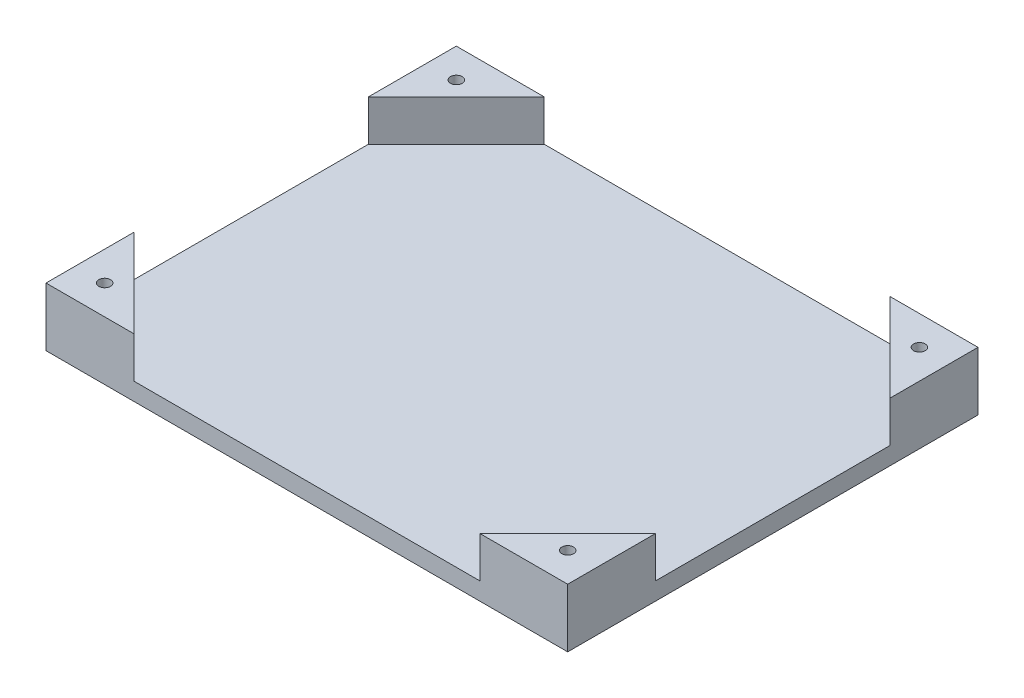
ISO-10303-21;
HEADER;
FILE_DESCRIPTION(('STEP AP214'),'2;1');
FILE_NAME('part.step','',(''),(''),'','','');
FILE_SCHEMA(('AUTOMOTIVE_DESIGN { 1 0 10303 214 1 1 1 1 }'));
ENDSEC;
DATA;
#1=APPLICATION_CONTEXT('core data for automotive mechanical design processes');
#2=APPLICATION_PROTOCOL_DEFINITION('international standard','automotive_design',2000,#1);
#3=PRODUCT_CONTEXT('',#1,'mechanical');
#4=PRODUCT('Part','Part','',(#3));
#5=PRODUCT_RELATED_PRODUCT_CATEGORY('part','',(#4));
#6=PRODUCT_DEFINITION_FORMATION('','',#4);
#7=PRODUCT_DEFINITION_CONTEXT('part definition',#1,'design');
#8=PRODUCT_DEFINITION('design','',#6,#7);
#9=PRODUCT_DEFINITION_SHAPE('','',#8);
#10=(LENGTH_UNIT() NAMED_UNIT(*) SI_UNIT(.MILLI.,.METRE.));
#11=(NAMED_UNIT(*) PLANE_ANGLE_UNIT() SI_UNIT($,.RADIAN.));
#12=(NAMED_UNIT(*) SI_UNIT($,.STERADIAN.) SOLID_ANGLE_UNIT());
#13=UNCERTAINTY_MEASURE_WITH_UNIT(LENGTH_MEASURE(1.E-05),#10,'distance_accuracy_value','');
#14=(GEOMETRIC_REPRESENTATION_CONTEXT(3) GLOBAL_UNCERTAINTY_ASSIGNED_CONTEXT((#13)) GLOBAL_UNIT_ASSIGNED_CONTEXT((#10,
#11,#12)) REPRESENTATION_CONTEXT('',''));
#15=CARTESIAN_POINT('',(0.,0.,0.));
#16=DIRECTION('',(0.,0.,1.));
#17=DIRECTION('',(1.,0.,0.));
#18=AXIS2_PLACEMENT_3D('',#15,#16,#17);
#19=CARTESIAN_POINT('',(0.,10.,0.));
#20=DIRECTION('',(0.,-1.,0.));
#21=DIRECTION('',(0.,0.,-1.));
#22=AXIS2_PLACEMENT_3D('',#19,#20,#21);
#23=PLANE('',#22);
#24=CARTESIAN_POINT('',(-39.5,10.,-30.));
#25=DIRECTION('',(0.,1.,0.));
#26=DIRECTION('',(0.,0.,1.));
#27=AXIS2_PLACEMENT_3D('',#24,#25,#26);
#28=CIRCLE('',#27,0.999999999999998);
#29=CARTESIAN_POINT('',(-39.5,10.,-29.));
#30=VERTEX_POINT('',#29);
#31=EDGE_CURVE('E184',#30,#30,#28,.T.);
#32=ORIENTED_EDGE('',*,*,#31,.F.);
#33=EDGE_LOOP('',(#32));
#34=FACE_BOUND('',#33,.T.);
#35=DIRECTION('',(0.,0.,1.));
#36=VECTOR('',#35,1.);
#37=CARTESIAN_POINT('',(-44.5,10.,35.));
#38=LINE('',#37,#36);
#39=CARTESIAN_POINT('',(-44.5,10.,-35.));
#40=VERTEX_POINT('',#39);
#41=CARTESIAN_POINT('',(-44.5,10.,-19.9999999999999));
#42=VERTEX_POINT('',#41);
#43=EDGE_CURVE('E195',#40,#42,#38,.T.);
#44=ORIENTED_EDGE('',*,*,#43,.T.);
#45=DIRECTION('',(-0.707106781186544,0.,0.707106781186551));
#46=VECTOR('',#45,1.);
#47=CARTESIAN_POINT('',(-29.5000000000001,10.,-35.));
#48=LINE('',#47,#46);
#49=CARTESIAN_POINT('',(-29.5000000000001,10.,-35.));
#50=VERTEX_POINT('',#49);
#51=EDGE_CURVE('E151',#50,#42,#48,.T.);
#52=ORIENTED_EDGE('',*,*,#51,.F.);
#53=DIRECTION('',(-1.,0.,0.));
#54=VECTOR('',#53,1.);
#55=CARTESIAN_POINT('',(-44.5,10.,-35.));
#56=LINE('',#55,#54);
#57=EDGE_CURVE('E192',#50,#40,#56,.T.);
#58=ORIENTED_EDGE('',*,*,#57,.T.);
#59=EDGE_LOOP('',(#44,#52,#58));
#60=FACE_BOUND('',#59,.T.);
#61=ADVANCED_FACE('F33',(#34,#60),#23,.F.);
#62=CARTESIAN_POINT('',(39.5,10.,-30.));
#63=DIRECTION('',(0.,1.,0.));
#64=DIRECTION('',(0.,0.,-1.));
#65=AXIS2_PLACEMENT_3D('',#62,#63,#64);
#66=CIRCLE('',#65,0.999999999999998);
#67=CARTESIAN_POINT('',(39.5,10.,-31.));
#68=VERTEX_POINT('',#67);
#69=EDGE_CURVE('E178',#68,#68,#66,.T.);
#70=ORIENTED_EDGE('',*,*,#69,.F.);
#71=EDGE_LOOP('',(#70));
#72=FACE_BOUND('',#71,.T.);
#73=CARTESIAN_POINT('',(44.5,10.,-35.));
#74=VERTEX_POINT('',#73);
#75=CARTESIAN_POINT('',(29.4999999999999,10.,-35.));
#76=VERTEX_POINT('',#75);
#77=EDGE_CURVE('E193',#74,#76,#56,.T.);
#78=ORIENTED_EDGE('',*,*,#77,.T.);
#79=DIRECTION('',(-0.707106781186549,0.,-0.707106781186546));
#80=VECTOR('',#79,1.);
#81=CARTESIAN_POINT('',(44.5,10.,-20.));
#82=LINE('',#81,#80);
#83=CARTESIAN_POINT('',(44.5,10.,-20.));
#84=VERTEX_POINT('',#83);
#85=EDGE_CURVE('E240',#84,#76,#82,.T.);
#86=ORIENTED_EDGE('',*,*,#85,.F.);
#87=DIRECTION('',(0.,0.,-1.));
#88=VECTOR('',#87,1.);
#89=CARTESIAN_POINT('',(44.5,10.,35.));
#90=LINE('',#89,#88);
#91=EDGE_CURVE('E87',#84,#74,#90,.T.);
#92=ORIENTED_EDGE('',*,*,#91,.T.);
#93=EDGE_LOOP('',(#78,#86,#92));
#94=FACE_BOUND('',#93,.T.);
#95=ADVANCED_FACE('F260',(#72,#94),#23,.F.);
#96=CARTESIAN_POINT('',(39.5,10.,30.));
#97=DIRECTION('',(0.,1.,0.));
#98=DIRECTION('',(0.,0.,1.));
#99=AXIS2_PLACEMENT_3D('',#96,#97,#98);
#100=CIRCLE('',#99,0.999999999999998);
#101=CARTESIAN_POINT('',(39.5,10.,31.));
#102=VERTEX_POINT('',#101);
#103=EDGE_CURVE('E172',#102,#102,#100,.T.);
#104=ORIENTED_EDGE('',*,*,#103,.F.);
#105=EDGE_LOOP('',(#104));
#106=FACE_BOUND('',#105,.T.);
#107=CARTESIAN_POINT('',(44.5,10.,35.));
#108=VERTEX_POINT('',#107);
#109=CARTESIAN_POINT('',(44.5,10.,20.));
#110=VERTEX_POINT('',#109);
#111=EDGE_CURVE('E190',#108,#110,#90,.T.);
#112=ORIENTED_EDGE('',*,*,#111,.T.);
#113=DIRECTION('',(0.707106781186546,0.,-0.707106781186549));
#114=VECTOR('',#113,1.);
#115=CARTESIAN_POINT('',(29.5,10.,35.));
#116=LINE('',#115,#114);
#117=CARTESIAN_POINT('',(29.5,10.,35.));
#118=VERTEX_POINT('',#117);
#119=EDGE_CURVE('E242',#118,#110,#116,.T.);
#120=ORIENTED_EDGE('',*,*,#119,.F.);
#121=DIRECTION('',(1.,0.,0.));
#122=VECTOR('',#121,1.);
#123=CARTESIAN_POINT('',(-44.5,10.,35.));
#124=LINE('',#123,#122);
#125=EDGE_CURVE('E57',#118,#108,#124,.T.);
#126=ORIENTED_EDGE('',*,*,#125,.T.);
#127=EDGE_LOOP('',(#112,#120,#126));
#128=FACE_BOUND('',#127,.T.);
#129=ADVANCED_FACE('F275',(#106,#128),#23,.F.);
#130=CARTESIAN_POINT('',(-44.5,10.,35.));
#131=VERTEX_POINT('',#130);
#132=CARTESIAN_POINT('',(-29.4999999999999,10.,35.));
#133=VERTEX_POINT('',#132);
#134=EDGE_CURVE('E198',#131,#133,#124,.T.);
#135=ORIENTED_EDGE('',*,*,#134,.T.);
#136=DIRECTION('',(0.707106781186549,0.,0.707106781186546));
#137=VECTOR('',#136,1.);
#138=CARTESIAN_POINT('',(-44.5,10.,20.));
#139=LINE('',#138,#137);
#140=CARTESIAN_POINT('',(-44.5,10.,20.));
#141=VERTEX_POINT('',#140);
#142=EDGE_CURVE('E244',#141,#133,#139,.T.);
#143=ORIENTED_EDGE('',*,*,#142,.F.);
#144=EDGE_CURVE('E156',#141,#131,#38,.T.);
#145=ORIENTED_EDGE('',*,*,#144,.T.);
#146=EDGE_LOOP('',(#135,#143,#145));
#147=FACE_BOUND('',#146,.T.);
#148=CARTESIAN_POINT('',(-39.5,10.,30.));
#149=DIRECTION('',(0.,1.,0.));
#150=DIRECTION('',(0.,0.,-1.));
#151=AXIS2_PLACEMENT_3D('',#148,#149,#150);
#152=CIRCLE('',#151,0.999999999999998);
#153=CARTESIAN_POINT('',(-39.5,10.,29.));
#154=VERTEX_POINT('',#153);
#155=EDGE_CURVE('E164',#154,#154,#152,.T.);
#156=ORIENTED_EDGE('',*,*,#155,.F.);
#157=EDGE_LOOP('',(#156));
#158=FACE_BOUND('',#157,.T.);
#159=ADVANCED_FACE('F271',(#147,#158),#23,.F.);
#160=CARTESIAN_POINT('',(0.,0.,0.));
#161=DIRECTION('',(0.,-1.,0.));
#162=DIRECTION('',(0.,0.,-1.));
#163=AXIS2_PLACEMENT_3D('',#160,#161,#162);
#164=PLANE('',#163);
#165=CARTESIAN_POINT('',(39.5,0.,30.));
#166=DIRECTION('',(0.,1.,0.));
#167=DIRECTION('',(0.,0.,1.));
#168=AXIS2_PLACEMENT_3D('',#165,#166,#167);
#169=CIRCLE('',#168,0.999999999999998);
#170=CARTESIAN_POINT('',(39.5,0.,31.));
#171=VERTEX_POINT('',#170);
#172=EDGE_CURVE('E167',#171,#171,#169,.T.);
#173=ORIENTED_EDGE('',*,*,#172,.T.);
#174=EDGE_LOOP('',(#173));
#175=FACE_BOUND('',#174,.T.);
#176=CARTESIAN_POINT('',(-39.5,0.,-30.));
#177=DIRECTION('',(0.,1.,0.));
#178=DIRECTION('',(0.,0.,1.));
#179=AXIS2_PLACEMENT_3D('',#176,#177,#178);
#180=CIRCLE('',#179,0.999999999999998);
#181=CARTESIAN_POINT('',(-39.5,0.,-29.));
#182=VERTEX_POINT('',#181);
#183=EDGE_CURVE('E181',#182,#182,#180,.T.);
#184=ORIENTED_EDGE('',*,*,#183,.T.);
#185=EDGE_LOOP('',(#184));
#186=FACE_BOUND('',#185,.T.);
#187=DIRECTION('',(0.,0.,-1.));
#188=VECTOR('',#187,1.);
#189=CARTESIAN_POINT('',(44.5,0.,35.));
#190=LINE('',#189,#188);
#191=CARTESIAN_POINT('',(44.5,0.,35.));
#192=VERTEX_POINT('',#191);
#193=CARTESIAN_POINT('',(44.5,0.,-35.));
#194=VERTEX_POINT('',#193);
#195=EDGE_CURVE('E187',#192,#194,#190,.T.);
#196=ORIENTED_EDGE('',*,*,#195,.F.);
#197=DIRECTION('',(1.,0.,0.));
#198=VECTOR('',#197,1.);
#199=CARTESIAN_POINT('',(-44.5,0.,35.));
#200=LINE('',#199,#198);
#201=CARTESIAN_POINT('',(-44.5,0.,35.));
#202=VERTEX_POINT('',#201);
#203=EDGE_CURVE('E79',#202,#192,#200,.T.);
#204=ORIENTED_EDGE('',*,*,#203,.F.);
#205=DIRECTION('',(0.,0.,1.));
#206=VECTOR('',#205,1.);
#207=CARTESIAN_POINT('',(-44.5,0.,35.));
#208=LINE('',#207,#206);
#209=CARTESIAN_POINT('',(-44.5,0.,-35.));
#210=VERTEX_POINT('',#209);
#211=EDGE_CURVE('E206',#210,#202,#208,.T.);
#212=ORIENTED_EDGE('',*,*,#211,.F.);
#213=DIRECTION('',(-1.,0.,0.));
#214=VECTOR('',#213,1.);
#215=CARTESIAN_POINT('',(-44.5,0.,-35.));
#216=LINE('',#215,#214);
#217=EDGE_CURVE('E204',#194,#210,#216,.T.);
#218=ORIENTED_EDGE('',*,*,#217,.F.);
#219=EDGE_LOOP('',(#196,#204,#212,#218));
#220=FACE_BOUND('',#219,.T.);
#221=CARTESIAN_POINT('',(39.5,0.,-30.));
#222=DIRECTION('',(0.,1.,0.));
#223=DIRECTION('',(0.,0.,-1.));
#224=AXIS2_PLACEMENT_3D('',#221,#222,#223);
#225=CIRCLE('',#224,0.999999999999998);
#226=CARTESIAN_POINT('',(39.5,0.,-31.));
#227=VERTEX_POINT('',#226);
#228=EDGE_CURVE('E175',#227,#227,#225,.T.);
#229=ORIENTED_EDGE('',*,*,#228,.T.);
#230=EDGE_LOOP('',(#229));
#231=FACE_BOUND('',#230,.T.);
#232=CARTESIAN_POINT('',(-39.5,0.,30.));
#233=DIRECTION('',(0.,1.,0.));
#234=DIRECTION('',(0.,0.,-1.));
#235=AXIS2_PLACEMENT_3D('',#232,#233,#234);
#236=CIRCLE('',#235,0.999999999999998);
#237=CARTESIAN_POINT('',(-39.5,0.,29.));
#238=VERTEX_POINT('',#237);
#239=EDGE_CURVE('E168',#238,#238,#236,.T.);
#240=ORIENTED_EDGE('',*,*,#239,.T.);
#241=EDGE_LOOP('',(#240));
#242=FACE_BOUND('',#241,.T.);
#243=ADVANCED_FACE('F219',(#175,#186,#220,#231,#242),#164,.T.);
#244=CARTESIAN_POINT('',(44.5,10.,35.));
#245=DIRECTION('',(-1.,0.,0.));
#246=DIRECTION('',(0.,0.,1.));
#247=AXIS2_PLACEMENT_3D('',#244,#245,#246);
#248=PLANE('',#247);
#249=ORIENTED_EDGE('',*,*,#91,.F.);
#250=DIRECTION('',(0.,1.,0.));
#251=VECTOR('',#250,1.);
#252=CARTESIAN_POINT('',(44.5,3.,-20.));
#253=LINE('',#252,#251);
#254=CARTESIAN_POINT('',(44.5,3.,-20.));
#255=VERTEX_POINT('',#254);
#256=EDGE_CURVE('E229',#255,#84,#253,.T.);
#257=ORIENTED_EDGE('',*,*,#256,.F.);
#258=DIRECTION('',(0.,0.,-1.));
#259=VECTOR('',#258,1.);
#260=CARTESIAN_POINT('',(44.5,3.,20.));
#261=LINE('',#260,#259);
#262=CARTESIAN_POINT('',(44.5,3.,20.));
#263=VERTEX_POINT('',#262);
#264=EDGE_CURVE('E250',#263,#255,#261,.T.);
#265=ORIENTED_EDGE('',*,*,#264,.F.);
#266=DIRECTION('',(0.,1.,0.));
#267=VECTOR('',#266,1.);
#268=CARTESIAN_POINT('',(44.5,3.,20.));
#269=LINE('',#268,#267);
#270=EDGE_CURVE('E228',#263,#110,#269,.T.);
#271=ORIENTED_EDGE('',*,*,#270,.T.);
#272=ORIENTED_EDGE('',*,*,#111,.F.);
#273=DIRECTION('',(0.,-1.,0.));
#274=VECTOR('',#273,1.);
#275=CARTESIAN_POINT('',(44.5,10.,35.));
#276=LINE('',#275,#274);
#277=EDGE_CURVE('E201',#108,#192,#276,.T.);
#278=ORIENTED_EDGE('',*,*,#277,.T.);
#279=ORIENTED_EDGE('',*,*,#195,.T.);
#280=DIRECTION('',(0.,-1.,0.));
#281=VECTOR('',#280,1.);
#282=CARTESIAN_POINT('',(44.5,10.,-35.));
#283=LINE('',#282,#281);
#284=EDGE_CURVE('E11',#74,#194,#283,.T.);
#285=ORIENTED_EDGE('',*,*,#284,.F.);
#286=EDGE_LOOP('',(#249,#257,#265,#271,#272,#278,#279,#285));
#287=FACE_BOUND('',#286,.T.);
#288=ADVANCED_FACE('F35',(#287),#248,.F.);
#289=CARTESIAN_POINT('',(-44.5,10.,-35.));
#290=DIRECTION('',(0.,0.,1.));
#291=DIRECTION('',(1.,0.,0.));
#292=AXIS2_PLACEMENT_3D('',#289,#290,#291);
#293=PLANE('',#292);
#294=ORIENTED_EDGE('',*,*,#57,.F.);
#295=DIRECTION('',(0.,1.,0.));
#296=VECTOR('',#295,1.);
#297=CARTESIAN_POINT('',(-29.5000000000001,3.,-35.));
#298=LINE('',#297,#296);
#299=CARTESIAN_POINT('',(-29.5000000000001,3.,-35.));
#300=VERTEX_POINT('',#299);
#301=EDGE_CURVE('E236',#300,#50,#298,.T.);
#302=ORIENTED_EDGE('',*,*,#301,.F.);
#303=DIRECTION('',(-1.,0.,0.));
#304=VECTOR('',#303,1.);
#305=CARTESIAN_POINT('',(29.4999999999999,3.,-35.));
#306=LINE('',#305,#304);
#307=CARTESIAN_POINT('',(29.4999999999999,3.,-35.));
#308=VERTEX_POINT('',#307);
#309=EDGE_CURVE('E160',#308,#300,#306,.T.);
#310=ORIENTED_EDGE('',*,*,#309,.F.);
#311=DIRECTION('',(0.,1.,0.));
#312=VECTOR('',#311,1.);
#313=CARTESIAN_POINT('',(29.4999999999999,3.,-35.));
#314=LINE('',#313,#312);
#315=EDGE_CURVE('E233',#308,#76,#314,.T.);
#316=ORIENTED_EDGE('',*,*,#315,.T.);
#317=ORIENTED_EDGE('',*,*,#77,.F.);
#318=ORIENTED_EDGE('',*,*,#284,.T.);
#319=ORIENTED_EDGE('',*,*,#217,.T.);
#320=DIRECTION('',(0.,-1.,0.));
#321=VECTOR('',#320,1.);
#322=CARTESIAN_POINT('',(-44.5,10.,-35.));
#323=LINE('',#322,#321);
#324=EDGE_CURVE('E41',#40,#210,#323,.T.);
#325=ORIENTED_EDGE('',*,*,#324,.F.);
#326=EDGE_LOOP('',(#294,#302,#310,#316,#317,#318,#319,#325));
#327=FACE_BOUND('',#326,.T.);
#328=ADVANCED_FACE('F261',(#327),#293,.F.);
#329=CARTESIAN_POINT('',(-44.5,10.,35.));
#330=DIRECTION('',(1.,0.,0.));
#331=DIRECTION('',(0.,0.,-1.));
#332=AXIS2_PLACEMENT_3D('',#329,#330,#331);
#333=PLANE('',#332);
#334=DIRECTION('',(0.,0.,1.));
#335=VECTOR('',#334,1.);
#336=CARTESIAN_POINT('',(-44.5,3.,-19.9999999999999));
#337=LINE('',#336,#335);
#338=CARTESIAN_POINT('',(-44.5,3.,-19.9999999999999));
#339=VERTEX_POINT('',#338);
#340=CARTESIAN_POINT('',(-44.5,3.,20.));
#341=VERTEX_POINT('',#340);
#342=EDGE_CURVE('E142',#339,#341,#337,.T.);
#343=ORIENTED_EDGE('',*,*,#342,.F.);
#344=DIRECTION('',(0.,1.,0.));
#345=VECTOR('',#344,1.);
#346=CARTESIAN_POINT('',(-44.5,3.,-19.9999999999999));
#347=LINE('',#346,#345);
#348=EDGE_CURVE('E171',#339,#42,#347,.T.);
#349=ORIENTED_EDGE('',*,*,#348,.T.);
#350=ORIENTED_EDGE('',*,*,#43,.F.);
#351=ORIENTED_EDGE('',*,*,#324,.T.);
#352=ORIENTED_EDGE('',*,*,#211,.T.);
#353=DIRECTION('',(0.,-1.,0.));
#354=VECTOR('',#353,1.);
#355=CARTESIAN_POINT('',(-44.5,10.,35.));
#356=LINE('',#355,#354);
#357=EDGE_CURVE('E210',#131,#202,#356,.T.);
#358=ORIENTED_EDGE('',*,*,#357,.F.);
#359=ORIENTED_EDGE('',*,*,#144,.F.);
#360=DIRECTION('',(0.,1.,0.));
#361=VECTOR('',#360,1.);
#362=CARTESIAN_POINT('',(-44.5,3.,20.));
#363=LINE('',#362,#361);
#364=EDGE_CURVE('E136',#341,#141,#363,.T.);
#365=ORIENTED_EDGE('',*,*,#364,.F.);
#366=EDGE_LOOP('',(#343,#349,#350,#351,#352,#358,#359,#365));
#367=FACE_BOUND('',#366,.T.);
#368=ADVANCED_FACE('F154',(#367),#333,.F.);
#369=CARTESIAN_POINT('',(-44.5,10.,35.));
#370=DIRECTION('',(0.,0.,-1.));
#371=DIRECTION('',(-1.,0.,0.));
#372=AXIS2_PLACEMENT_3D('',#369,#370,#371);
#373=PLANE('',#372);
#374=ORIENTED_EDGE('',*,*,#125,.F.);
#375=DIRECTION('',(0.,1.,0.));
#376=VECTOR('',#375,1.);
#377=CARTESIAN_POINT('',(29.5,3.,35.));
#378=LINE('',#377,#376);
#379=CARTESIAN_POINT('',(29.5,3.,35.));
#380=VERTEX_POINT('',#379);
#381=EDGE_CURVE('E158',#380,#118,#378,.T.);
#382=ORIENTED_EDGE('',*,*,#381,.F.);
#383=DIRECTION('',(1.,0.,0.));
#384=VECTOR('',#383,1.);
#385=CARTESIAN_POINT('',(-29.4999999999999,3.,35.));
#386=LINE('',#385,#384);
#387=CARTESIAN_POINT('',(-29.4999999999999,3.,35.));
#388=VERTEX_POINT('',#387);
#389=EDGE_CURVE('E141',#388,#380,#386,.T.);
#390=ORIENTED_EDGE('',*,*,#389,.F.);
#391=DIRECTION('',(0.,1.,0.));
#392=VECTOR('',#391,1.);
#393=CARTESIAN_POINT('',(-29.4999999999999,3.,35.));
#394=LINE('',#393,#392);
#395=EDGE_CURVE('E139',#388,#133,#394,.T.);
#396=ORIENTED_EDGE('',*,*,#395,.T.);
#397=ORIENTED_EDGE('',*,*,#134,.F.);
#398=ORIENTED_EDGE('',*,*,#357,.T.);
#399=ORIENTED_EDGE('',*,*,#203,.T.);
#400=ORIENTED_EDGE('',*,*,#277,.F.);
#401=EDGE_LOOP('',(#374,#382,#390,#396,#397,#398,#399,#400));
#402=FACE_BOUND('',#401,.T.);
#403=ADVANCED_FACE('F225',(#402),#373,.F.);
#404=CARTESIAN_POINT('',(-39.5,10.,-30.));
#405=DIRECTION('',(0.,-1.,0.));
#406=DIRECTION('',(0.,0.,-1.));
#407=AXIS2_PLACEMENT_3D('',#404,#405,#406);
#408=CYLINDRICAL_SURFACE('',#407,0.999999999999998);
#409=ORIENTED_EDGE('',*,*,#31,.T.);
#410=EDGE_LOOP('',(#409));
#411=FACE_BOUND('',#410,.T.);
#412=ORIENTED_EDGE('',*,*,#183,.F.);
#413=EDGE_LOOP('',(#412));
#414=FACE_BOUND('',#413,.T.);
#415=ADVANCED_FACE('F311',(#411,#414),#408,.F.);
#416=CARTESIAN_POINT('',(39.5,10.,-30.));
#417=DIRECTION('',(0.,-1.,0.));
#418=DIRECTION('',(0.,0.,-1.));
#419=AXIS2_PLACEMENT_3D('',#416,#417,#418);
#420=CYLINDRICAL_SURFACE('',#419,0.999999999999998);
#421=ORIENTED_EDGE('',*,*,#69,.T.);
#422=EDGE_LOOP('',(#421));
#423=FACE_BOUND('',#422,.T.);
#424=ORIENTED_EDGE('',*,*,#228,.F.);
#425=EDGE_LOOP('',(#424));
#426=FACE_BOUND('',#425,.T.);
#427=ADVANCED_FACE('F304',(#423,#426),#420,.F.);
#428=CARTESIAN_POINT('',(39.5,10.,30.));
#429=DIRECTION('',(0.,-1.,0.));
#430=DIRECTION('',(0.,0.,-1.));
#431=AXIS2_PLACEMENT_3D('',#428,#429,#430);
#432=CYLINDRICAL_SURFACE('',#431,0.999999999999998);
#433=ORIENTED_EDGE('',*,*,#103,.T.);
#434=EDGE_LOOP('',(#433));
#435=FACE_BOUND('',#434,.T.);
#436=ORIENTED_EDGE('',*,*,#172,.F.);
#437=EDGE_LOOP('',(#436));
#438=FACE_BOUND('',#437,.T.);
#439=ADVANCED_FACE('F295',(#435,#438),#432,.F.);
#440=CARTESIAN_POINT('',(-39.5,10.,30.));
#441=DIRECTION('',(0.,-1.,0.));
#442=DIRECTION('',(0.,0.,-1.));
#443=AXIS2_PLACEMENT_3D('',#440,#441,#442);
#444=CYLINDRICAL_SURFACE('',#443,0.999999999999998);
#445=ORIENTED_EDGE('',*,*,#155,.T.);
#446=EDGE_LOOP('',(#445));
#447=FACE_BOUND('',#446,.T.);
#448=ORIENTED_EDGE('',*,*,#239,.F.);
#449=EDGE_LOOP('',(#448));
#450=FACE_BOUND('',#449,.T.);
#451=ADVANCED_FACE('F292',(#447,#450),#444,.F.);
#452=CARTESIAN_POINT('',(-29.5000000000001,3.,-35.));
#453=DIRECTION('',(-0.707106781186551,0.,-0.707106781186544));
#454=DIRECTION('',(-0.707106781186544,0.,0.707106781186551));
#455=AXIS2_PLACEMENT_3D('',#452,#453,#454);
#456=PLANE('',#455);
#457=ORIENTED_EDGE('',*,*,#51,.T.);
#458=ORIENTED_EDGE('',*,*,#348,.F.);
#459=DIRECTION('',(-0.707106781186544,0.,0.707106781186551));
#460=VECTOR('',#459,1.);
#461=CARTESIAN_POINT('',(-29.5000000000001,3.,-35.));
#462=LINE('',#461,#460);
#463=EDGE_CURVE('E148',#300,#339,#462,.T.);
#464=ORIENTED_EDGE('',*,*,#463,.F.);
#465=ORIENTED_EDGE('',*,*,#301,.T.);
#466=EDGE_LOOP('',(#457,#458,#464,#465));
#467=FACE_BOUND('',#466,.T.);
#468=ADVANCED_FACE('F265',(#467),#456,.F.);
#469=CARTESIAN_POINT('',(44.5,3.,-20.));
#470=DIRECTION('',(0.707106781186546,0.,-0.707106781186549));
#471=DIRECTION('',(-0.707106781186549,0.,-0.707106781186546));
#472=AXIS2_PLACEMENT_3D('',#469,#470,#471);
#473=PLANE('',#472);
#474=ORIENTED_EDGE('',*,*,#85,.T.);
#475=ORIENTED_EDGE('',*,*,#315,.F.);
#476=DIRECTION('',(-0.707106781186549,0.,-0.707106781186546));
#477=VECTOR('',#476,1.);
#478=CARTESIAN_POINT('',(44.5,3.,-20.));
#479=LINE('',#478,#477);
#480=EDGE_CURVE('E247',#255,#308,#479,.T.);
#481=ORIENTED_EDGE('',*,*,#480,.F.);
#482=ORIENTED_EDGE('',*,*,#256,.T.);
#483=EDGE_LOOP('',(#474,#475,#481,#482));
#484=FACE_BOUND('',#483,.T.);
#485=ADVANCED_FACE('F259',(#484),#473,.F.);
#486=CARTESIAN_POINT('',(29.5,3.,35.));
#487=DIRECTION('',(0.707106781186549,0.,0.707106781186546));
#488=DIRECTION('',(0.707106781186546,0.,-0.707106781186549));
#489=AXIS2_PLACEMENT_3D('',#486,#487,#488);
#490=PLANE('',#489);
#491=ORIENTED_EDGE('',*,*,#119,.T.);
#492=ORIENTED_EDGE('',*,*,#270,.F.);
#493=DIRECTION('',(0.707106781186546,0.,-0.707106781186549));
#494=VECTOR('',#493,1.);
#495=CARTESIAN_POINT('',(29.5,3.,35.));
#496=LINE('',#495,#494);
#497=EDGE_CURVE('E253',#380,#263,#496,.T.);
#498=ORIENTED_EDGE('',*,*,#497,.F.);
#499=ORIENTED_EDGE('',*,*,#381,.T.);
#500=EDGE_LOOP('',(#491,#492,#498,#499));
#501=FACE_BOUND('',#500,.T.);
#502=ADVANCED_FACE('F392',(#501),#490,.F.);
#503=CARTESIAN_POINT('',(-44.5,3.,20.));
#504=DIRECTION('',(-0.707106781186546,0.,0.707106781186549));
#505=DIRECTION('',(0.707106781186549,0.,0.707106781186546));
#506=AXIS2_PLACEMENT_3D('',#503,#504,#505);
#507=PLANE('',#506);
#508=ORIENTED_EDGE('',*,*,#142,.T.);
#509=ORIENTED_EDGE('',*,*,#395,.F.);
#510=DIRECTION('',(0.707106781186549,0.,0.707106781186546));
#511=VECTOR('',#510,1.);
#512=CARTESIAN_POINT('',(-44.5,3.,20.));
#513=LINE('',#512,#511);
#514=EDGE_CURVE('E48',#341,#388,#513,.T.);
#515=ORIENTED_EDGE('',*,*,#514,.F.);
#516=ORIENTED_EDGE('',*,*,#364,.T.);
#517=EDGE_LOOP('',(#508,#509,#515,#516));
#518=FACE_BOUND('',#517,.T.);
#519=ADVANCED_FACE('F134',(#518),#507,.F.);
#520=CARTESIAN_POINT('',(0.,3.,0.));
#521=DIRECTION('',(0.,1.,0.));
#522=DIRECTION('',(0.,0.,1.));
#523=AXIS2_PLACEMENT_3D('',#520,#521,#522);
#524=PLANE('',#523);
#525=ORIENTED_EDGE('',*,*,#342,.T.);
#526=ORIENTED_EDGE('',*,*,#514,.T.);
#527=ORIENTED_EDGE('',*,*,#389,.T.);
#528=ORIENTED_EDGE('',*,*,#497,.T.);
#529=ORIENTED_EDGE('',*,*,#264,.T.);
#530=ORIENTED_EDGE('',*,*,#480,.T.);
#531=ORIENTED_EDGE('',*,*,#309,.T.);
#532=ORIENTED_EDGE('',*,*,#463,.T.);
#533=EDGE_LOOP('',(#525,#526,#527,#528,#529,#530,#531,#532));
#534=FACE_BOUND('',#533,.T.);
#535=ADVANCED_FACE('F146',(#534),#524,.T.);
#536=CLOSED_SHELL('',(#61,#95,#129,#159,#243,#288,#328,#368,#403,#415,#427,#439,#451,#468,#485,
#502,#519,#535));
#537=MANIFOLD_SOLID_BREP('B2',#536);
#538=ADVANCED_BREP_SHAPE_REPRESENTATION('',(#18,#537),#14);
#539=SHAPE_DEFINITION_REPRESENTATION(#9,#538);
ENDSEC;
END-ISO-10303-21;
